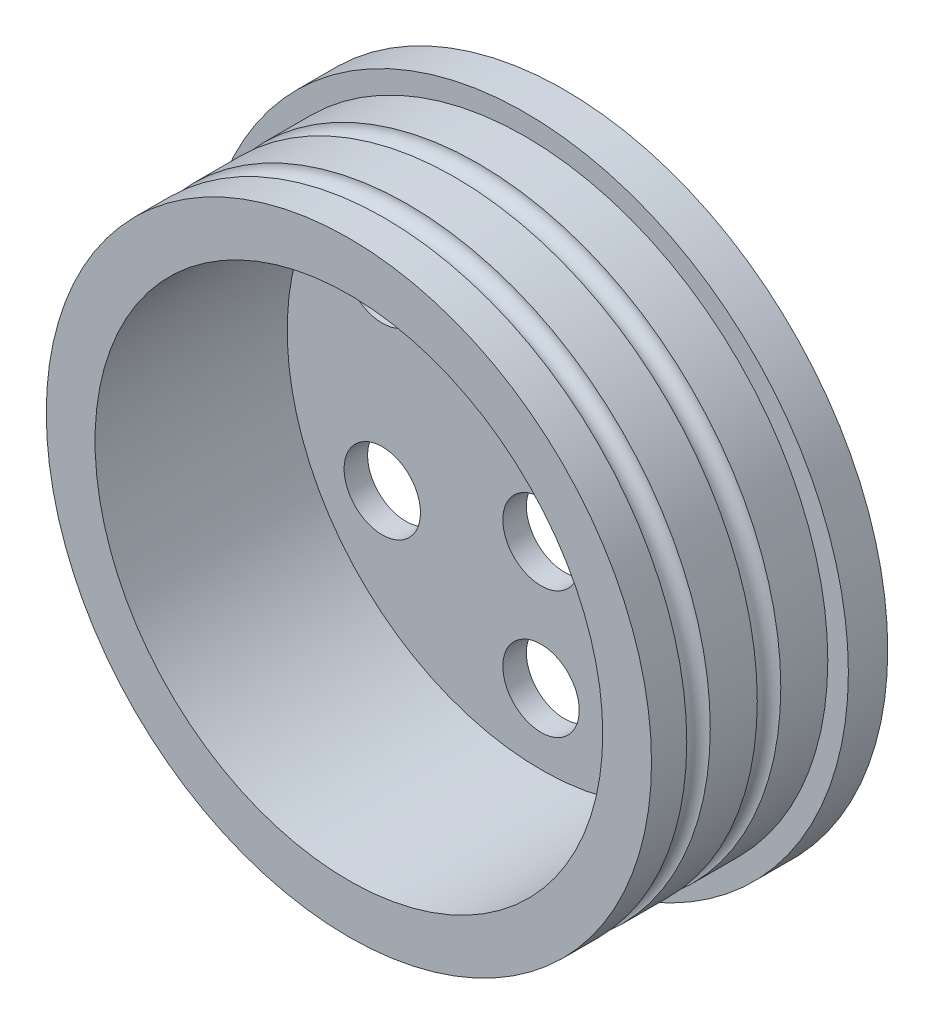
ISO-10303-21;
HEADER;
FILE_DESCRIPTION(('STEP AP214'),'2;1');
FILE_NAME('part.step','',(''),(''),'','','');
FILE_SCHEMA(('AUTOMOTIVE_DESIGN { 1 0 10303 214 1 1 1 1 }'));
ENDSEC;
DATA;
#1=APPLICATION_CONTEXT('core data for automotive mechanical design processes');
#2=APPLICATION_PROTOCOL_DEFINITION('international standard','automotive_design',2000,#1);
#3=PRODUCT_CONTEXT('',#1,'mechanical');
#4=PRODUCT('Part','Part','',(#3));
#5=PRODUCT_RELATED_PRODUCT_CATEGORY('part','',(#4));
#6=PRODUCT_DEFINITION_FORMATION('','',#4);
#7=PRODUCT_DEFINITION_CONTEXT('part definition',#1,'design');
#8=PRODUCT_DEFINITION('design','',#6,#7);
#9=PRODUCT_DEFINITION_SHAPE('','',#8);
#10=(LENGTH_UNIT() NAMED_UNIT(*) SI_UNIT(.MILLI.,.METRE.));
#11=(NAMED_UNIT(*) PLANE_ANGLE_UNIT() SI_UNIT($,.RADIAN.));
#12=(NAMED_UNIT(*) SI_UNIT($,.STERADIAN.) SOLID_ANGLE_UNIT());
#13=UNCERTAINTY_MEASURE_WITH_UNIT(LENGTH_MEASURE(1.E-05),#10,'distance_accuracy_value','');
#14=(GEOMETRIC_REPRESENTATION_CONTEXT(3) GLOBAL_UNCERTAINTY_ASSIGNED_CONTEXT((#13)) GLOBAL_UNIT_ASSIGNED_CONTEXT((#10,
#11,#12)) REPRESENTATION_CONTEXT('',''));
#15=CARTESIAN_POINT('',(0.,0.,0.));
#16=DIRECTION('',(0.,0.,1.));
#17=DIRECTION('',(1.,0.,0.));
#18=AXIS2_PLACEMENT_3D('',#15,#16,#17);
#19=CARTESIAN_POINT('',(0.,0.,36.7));
#20=DIRECTION('',(0.,0.,-1.));
#21=DIRECTION('',(-1.,0.,0.));
#22=AXIS2_PLACEMENT_3D('',#19,#20,#21);
#23=CYLINDRICAL_SURFACE('',#22,51.5);
#24=CARTESIAN_POINT('',(0.,0.,6.7));
#25=DIRECTION('',(0.,0.,1.));
#26=DIRECTION('',(1.,0.,0.));
#27=AXIS2_PLACEMENT_3D('',#24,#25,#26);
#28=CIRCLE('',#27,51.5);
#29=CARTESIAN_POINT('',(51.5,0.,6.7));
#30=VERTEX_POINT('',#29);
#31=EDGE_CURVE('E11',#30,#30,#28,.T.);
#32=ORIENTED_EDGE('',*,*,#31,.T.);
#33=EDGE_LOOP('',(#32));
#34=FACE_BOUND('',#33,.T.);
#35=CARTESIAN_POINT('',(0.,0.,14.7));
#36=DIRECTION('',(0.,0.,1.));
#37=DIRECTION('',(1.,0.,0.));
#38=AXIS2_PLACEMENT_3D('',#35,#36,#37);
#39=CIRCLE('',#38,51.5);
#40=CARTESIAN_POINT('',(51.5,0.,14.7));
#41=VERTEX_POINT('',#40);
#42=EDGE_CURVE('E63',#41,#41,#39,.T.);
#43=ORIENTED_EDGE('',*,*,#42,.F.);
#44=EDGE_LOOP('',(#43));
#45=FACE_BOUND('',#44,.T.);
#46=ADVANCED_FACE('F35',(#34,#45),#23,.T.);
#47=CARTESIAN_POINT('',(0.,0.,6.7));
#48=DIRECTION('',(0.,0.,-1.));
#49=DIRECTION('',(-1.,0.,0.));
#50=AXIS2_PLACEMENT_3D('',#47,#48,#49);
#51=CYLINDRICAL_SURFACE('',#50,55.);
#52=CARTESIAN_POINT('',(0.,0.,6.7));
#53=DIRECTION('',(0.,0.,1.));
#54=DIRECTION('',(1.,0.,0.));
#55=AXIS2_PLACEMENT_3D('',#52,#53,#54);
#56=CIRCLE('',#55,55.);
#57=CARTESIAN_POINT('',(55.,0.,6.7));
#58=VERTEX_POINT('',#57);
#59=EDGE_CURVE('E43',#58,#58,#56,.T.);
#60=ORIENTED_EDGE('',*,*,#59,.F.);
#61=EDGE_LOOP('',(#60));
#62=FACE_BOUND('',#61,.T.);
#63=CARTESIAN_POINT('',(0.,0.,0.));
#64=DIRECTION('',(0.,0.,1.));
#65=DIRECTION('',(1.,0.,0.));
#66=AXIS2_PLACEMENT_3D('',#63,#64,#65);
#67=CIRCLE('',#66,55.);
#68=CARTESIAN_POINT('',(55.,0.,0.));
#69=VERTEX_POINT('',#68);
#70=EDGE_CURVE('E48',#69,#69,#67,.T.);
#71=ORIENTED_EDGE('',*,*,#70,.T.);
#72=EDGE_LOOP('',(#71));
#73=FACE_BOUND('',#72,.T.);
#74=ADVANCED_FACE('F37',(#62,#73),#51,.T.);
#75=CARTESIAN_POINT('',(0.,0.,6.7));
#76=DIRECTION('',(0.,0.,1.));
#77=DIRECTION('',(1.,0.,0.));
#78=AXIS2_PLACEMENT_3D('',#75,#76,#77);
#79=PLANE('',#78);
#80=ORIENTED_EDGE('',*,*,#31,.F.);
#81=EDGE_LOOP('',(#80));
#82=FACE_BOUND('',#81,.T.);
#83=ORIENTED_EDGE('',*,*,#59,.T.);
#84=EDGE_LOOP('',(#83));
#85=FACE_BOUND('',#84,.T.);
#86=ADVANCED_FACE('F147',(#82,#85),#79,.T.);
#87=CARTESIAN_POINT('',(0.,0.,0.));
#88=DIRECTION('',(0.,0.,1.));
#89=DIRECTION('',(1.,0.,0.));
#90=AXIS2_PLACEMENT_3D('',#87,#88,#89);
#91=PLANE('',#90);
#92=CARTESIAN_POINT('',(0.,9.6,0.));
#93=DIRECTION('',(0.,0.,-1.));
#94=DIRECTION('',(-1.,0.,0.));
#95=AXIS2_PLACEMENT_3D('',#92,#93,#94);
#96=CIRCLE('',#95,6.49999999999999);
#97=CARTESIAN_POINT('',(-6.49999999999999,9.6,0.));
#98=VERTEX_POINT('',#97);
#99=EDGE_CURVE('E105',#98,#98,#96,.T.);
#100=ORIENTED_EDGE('',*,*,#99,.F.);
#101=EDGE_LOOP('',(#100));
#102=FACE_BOUND('',#101,.T.);
#103=CARTESIAN_POINT('',(0.,-9.6,0.));
#104=DIRECTION('',(0.,0.,-1.));
#105=DIRECTION('',(-1.,0.,0.));
#106=AXIS2_PLACEMENT_3D('',#103,#104,#105);
#107=CIRCLE('',#106,6.49999999999999);
#108=CARTESIAN_POINT('',(-6.49999999999999,-9.6,0.));
#109=VERTEX_POINT('',#108);
#110=EDGE_CURVE('E95',#109,#109,#107,.T.);
#111=ORIENTED_EDGE('',*,*,#110,.F.);
#112=EDGE_LOOP('',(#111));
#113=FACE_BOUND('',#112,.T.);
#114=CARTESIAN_POINT('',(27.0199925980743,15.6000000000003,0.));
#115=DIRECTION('',(0.,0.,-1.));
#116=DIRECTION('',(-1.,0.,0.));
#117=AXIS2_PLACEMENT_3D('',#114,#115,#116);
#118=CIRCLE('',#117,6.5);
#119=CARTESIAN_POINT('',(20.5199925980743,15.6000000000003,0.));
#120=VERTEX_POINT('',#119);
#121=EDGE_CURVE('E92',#120,#120,#118,.T.);
#122=ORIENTED_EDGE('',*,*,#121,.F.);
#123=EDGE_LOOP('',(#122));
#124=FACE_BOUND('',#123,.T.);
#125=CARTESIAN_POINT('',(27.0199925980746,-15.5999999999997,0.));
#126=DIRECTION('',(0.,0.,-1.));
#127=DIRECTION('',(-1.,0.,0.));
#128=AXIS2_PLACEMENT_3D('',#125,#126,#127);
#129=CIRCLE('',#128,6.5);
#130=CARTESIAN_POINT('',(20.5199925980746,-15.5999999999997,0.));
#131=VERTEX_POINT('',#130);
#132=EDGE_CURVE('E89',#131,#131,#129,.T.);
#133=ORIENTED_EDGE('',*,*,#132,.F.);
#134=EDGE_LOOP('',(#133));
#135=FACE_BOUND('',#134,.T.);
#136=CARTESIAN_POINT('',(0.,-31.2,0.));
#137=DIRECTION('',(0.,0.,-1.));
#138=DIRECTION('',(-1.,0.,0.));
#139=AXIS2_PLACEMENT_3D('',#136,#137,#138);
#140=CIRCLE('',#139,6.5);
#141=CARTESIAN_POINT('',(-6.5,-31.2,0.));
#142=VERTEX_POINT('',#141);
#143=EDGE_CURVE('E85',#142,#142,#140,.T.);
#144=ORIENTED_EDGE('',*,*,#143,.F.);
#145=EDGE_LOOP('',(#144));
#146=FACE_BOUND('',#145,.T.);
#147=CARTESIAN_POINT('',(-27.0199925980744,-15.6000000000001,0.));
#148=DIRECTION('',(0.,0.,-1.));
#149=DIRECTION('',(-1.,0.,0.));
#150=AXIS2_PLACEMENT_3D('',#147,#148,#149);
#151=CIRCLE('',#150,6.5);
#152=CARTESIAN_POINT('',(-33.5199925980744,-15.6000000000001,0.));
#153=VERTEX_POINT('',#152);
#154=EDGE_CURVE('E81',#153,#153,#151,.T.);
#155=ORIENTED_EDGE('',*,*,#154,.F.);
#156=EDGE_LOOP('',(#155));
#157=FACE_BOUND('',#156,.T.);
#158=CARTESIAN_POINT('',(-27.0199925980745,15.5999999999999,0.));
#159=DIRECTION('',(0.,0.,-1.));
#160=DIRECTION('',(-1.,0.,0.));
#161=AXIS2_PLACEMENT_3D('',#158,#159,#160);
#162=CIRCLE('',#161,6.5);
#163=CARTESIAN_POINT('',(-33.5199925980745,15.5999999999999,0.));
#164=VERTEX_POINT('',#163);
#165=EDGE_CURVE('E77',#164,#164,#162,.T.);
#166=ORIENTED_EDGE('',*,*,#165,.F.);
#167=EDGE_LOOP('',(#166));
#168=FACE_BOUND('',#167,.T.);
#169=CARTESIAN_POINT('',(0.,31.2,0.));
#170=DIRECTION('',(0.,0.,-1.));
#171=DIRECTION('',(-1.,0.,0.));
#172=AXIS2_PLACEMENT_3D('',#169,#170,#171);
#173=CIRCLE('',#172,6.5);
#174=CARTESIAN_POINT('',(-6.5,31.2,0.));
#175=VERTEX_POINT('',#174);
#176=EDGE_CURVE('E73',#175,#175,#173,.T.);
#177=ORIENTED_EDGE('',*,*,#176,.F.);
#178=EDGE_LOOP('',(#177));
#179=FACE_BOUND('',#178,.T.);
#180=ORIENTED_EDGE('',*,*,#70,.F.);
#181=EDGE_LOOP('',(#180));
#182=FACE_BOUND('',#181,.T.);
#183=ADVANCED_FACE('F165',(#102,#113,#124,#135,#146,#157,#168,#179,#182),#91,.F.);
#184=CARTESIAN_POINT('',(0.,0.,16.7));
#185=DIRECTION('',(0.,0.,1.));
#186=DIRECTION('',(1.,0.,0.));
#187=AXIS2_PLACEMENT_3D('',#184,#185,#186);
#188=TOROIDAL_SURFACE('',#187,51.5,2.);
#189=ORIENTED_EDGE('',*,*,#42,.T.);
#190=EDGE_LOOP('',(#189));
#191=FACE_BOUND('',#190,.T.);
#192=CARTESIAN_POINT('',(0.,0.,18.7));
#193=DIRECTION('',(0.,0.,-1.));
#194=DIRECTION('',(-1.,0.,0.));
#195=AXIS2_PLACEMENT_3D('',#192,#193,#194);
#196=CIRCLE('',#195,51.5);
#197=CARTESIAN_POINT('',(-51.5,0.,18.7));
#198=VERTEX_POINT('',#197);
#199=EDGE_CURVE('E66',#198,#198,#196,.T.);
#200=ORIENTED_EDGE('',*,*,#199,.T.);
#201=EDGE_LOOP('',(#200));
#202=FACE_BOUND('',#201,.T.);
#203=ADVANCED_FACE('F157',(#191,#202),#188,.F.);
#204=CARTESIAN_POINT('',(0.,0.,26.7));
#205=DIRECTION('',(0.,0.,1.));
#206=DIRECTION('',(1.,0.,0.));
#207=AXIS2_PLACEMENT_3D('',#204,#205,#206);
#208=CIRCLE('',#207,51.5);
#209=CARTESIAN_POINT('',(51.5,0.,26.7));
#210=VERTEX_POINT('',#209);
#211=EDGE_CURVE('E56',#210,#210,#208,.T.);
#212=ORIENTED_EDGE('',*,*,#211,.F.);
#213=EDGE_LOOP('',(#212));
#214=FACE_BOUND('',#213,.T.);
#215=ORIENTED_EDGE('',*,*,#199,.F.);
#216=EDGE_LOOP('',(#215));
#217=FACE_BOUND('',#216,.T.);
#218=ADVANCED_FACE('F143',(#214,#217),#23,.T.);
#219=CARTESIAN_POINT('',(0.,0.,28.7));
#220=DIRECTION('',(0.,0.,1.));
#221=DIRECTION('',(1.,0.,0.));
#222=AXIS2_PLACEMENT_3D('',#219,#220,#221);
#223=TOROIDAL_SURFACE('',#222,51.5,2.);
#224=ORIENTED_EDGE('',*,*,#211,.T.);
#225=EDGE_LOOP('',(#224));
#226=FACE_BOUND('',#225,.T.);
#227=CARTESIAN_POINT('',(0.,0.,30.7));
#228=DIRECTION('',(0.,0.,-1.));
#229=DIRECTION('',(-1.,0.,0.));
#230=AXIS2_PLACEMENT_3D('',#227,#228,#229);
#231=CIRCLE('',#230,51.5);
#232=CARTESIAN_POINT('',(-51.5,0.,30.7));
#233=VERTEX_POINT('',#232);
#234=EDGE_CURVE('E59',#233,#233,#231,.T.);
#235=ORIENTED_EDGE('',*,*,#234,.T.);
#236=EDGE_LOOP('',(#235));
#237=FACE_BOUND('',#236,.T.);
#238=ADVANCED_FACE('F156',(#226,#237),#223,.F.);
#239=CARTESIAN_POINT('',(0.,0.,36.7));
#240=DIRECTION('',(0.,0.,1.));
#241=DIRECTION('',(1.,0.,0.));
#242=AXIS2_PLACEMENT_3D('',#239,#240,#241);
#243=PLANE('',#242);
#244=CARTESIAN_POINT('',(0.,0.,36.7));
#245=DIRECTION('',(0.,0.,1.));
#246=DIRECTION('',(1.,0.,0.));
#247=AXIS2_PLACEMENT_3D('',#244,#245,#246);
#248=CIRCLE('',#247,43.2);
#249=CARTESIAN_POINT('',(43.2,0.,36.7));
#250=VERTEX_POINT('',#249);
#251=EDGE_CURVE('E72',#250,#250,#248,.T.);
#252=ORIENTED_EDGE('',*,*,#251,.F.);
#253=EDGE_LOOP('',(#252));
#254=FACE_BOUND('',#253,.T.);
#255=CARTESIAN_POINT('',(0.,0.,36.7));
#256=DIRECTION('',(0.,0.,1.));
#257=DIRECTION('',(1.,0.,0.));
#258=AXIS2_PLACEMENT_3D('',#255,#256,#257);
#259=CIRCLE('',#258,51.5);
#260=CARTESIAN_POINT('',(51.5,0.,36.7));
#261=VERTEX_POINT('',#260);
#262=EDGE_CURVE('E51',#261,#261,#259,.T.);
#263=ORIENTED_EDGE('',*,*,#262,.T.);
#264=EDGE_LOOP('',(#263));
#265=FACE_BOUND('',#264,.T.);
#266=ADVANCED_FACE('F153',(#254,#265),#243,.T.);
#267=ORIENTED_EDGE('',*,*,#262,.F.);
#268=EDGE_LOOP('',(#267));
#269=FACE_BOUND('',#268,.T.);
#270=ORIENTED_EDGE('',*,*,#234,.F.);
#271=EDGE_LOOP('',(#270));
#272=FACE_BOUND('',#271,.T.);
#273=ADVANCED_FACE('F137',(#269,#272),#23,.T.);
#274=CARTESIAN_POINT('',(0.,0.,-122.188051789035));
#275=DIRECTION('',(0.,0.,1.));
#276=DIRECTION('',(1.,0.,0.));
#277=AXIS2_PLACEMENT_3D('',#274,#275,#276);
#278=CYLINDRICAL_SURFACE('',#277,43.2);
#279=CARTESIAN_POINT('',(0.,0.,3.99999999999999));
#280=DIRECTION('',(0.,0.,1.));
#281=DIRECTION('',(1.,0.,0.));
#282=AXIS2_PLACEMENT_3D('',#279,#280,#281);
#283=CIRCLE('',#282,43.2);
#284=CARTESIAN_POINT('',(43.2,0.,3.99999999999999));
#285=VERTEX_POINT('',#284);
#286=EDGE_CURVE('E60',#285,#285,#283,.F.);
#287=ORIENTED_EDGE('',*,*,#286,.T.);
#288=EDGE_LOOP('',(#287));
#289=FACE_BOUND('',#288,.T.);
#290=ORIENTED_EDGE('',*,*,#251,.T.);
#291=EDGE_LOOP('',(#290));
#292=FACE_BOUND('',#291,.T.);
#293=ADVANCED_FACE('F122',(#289,#292),#278,.F.);
#294=CARTESIAN_POINT('',(0.,0.,4.));
#295=DIRECTION('',(0.,0.,1.));
#296=DIRECTION('',(1.,0.,0.));
#297=AXIS2_PLACEMENT_3D('',#294,#295,#296);
#298=PLANE('',#297);
#299=CARTESIAN_POINT('',(0.,9.6,4.));
#300=DIRECTION('',(0.,0.,1.));
#301=DIRECTION('',(1.,0.,0.));
#302=AXIS2_PLACEMENT_3D('',#299,#300,#301);
#303=CIRCLE('',#302,6.49999999999999);
#304=CARTESIAN_POINT('',(6.49999999999999,9.6,4.));
#305=VERTEX_POINT('',#304);
#306=EDGE_CURVE('E39',#305,#305,#303,.T.);
#307=ORIENTED_EDGE('',*,*,#306,.F.);
#308=EDGE_LOOP('',(#307));
#309=FACE_BOUND('',#308,.T.);
#310=CARTESIAN_POINT('',(0.,-9.6,4.));
#311=DIRECTION('',(0.,0.,1.));
#312=DIRECTION('',(1.,0.,0.));
#313=AXIS2_PLACEMENT_3D('',#310,#311,#312);
#314=CIRCLE('',#313,6.49999999999999);
#315=CARTESIAN_POINT('',(6.49999999999999,-9.6,4.));
#316=VERTEX_POINT('',#315);
#317=EDGE_CURVE('E93',#316,#316,#314,.T.);
#318=ORIENTED_EDGE('',*,*,#317,.F.);
#319=EDGE_LOOP('',(#318));
#320=FACE_BOUND('',#319,.T.);
#321=CARTESIAN_POINT('',(27.0199925980743,15.6000000000003,4.));
#322=DIRECTION('',(0.,0.,1.));
#323=DIRECTION('',(1.,0.,0.));
#324=AXIS2_PLACEMENT_3D('',#321,#322,#323);
#325=CIRCLE('',#324,6.5);
#326=CARTESIAN_POINT('',(33.5199925980743,15.6000000000003,4.));
#327=VERTEX_POINT('',#326);
#328=EDGE_CURVE('E90',#327,#327,#325,.T.);
#329=ORIENTED_EDGE('',*,*,#328,.F.);
#330=EDGE_LOOP('',(#329));
#331=FACE_BOUND('',#330,.T.);
#332=CARTESIAN_POINT('',(27.0199925980746,-15.5999999999997,4.));
#333=DIRECTION('',(0.,0.,1.));
#334=DIRECTION('',(1.,0.,0.));
#335=AXIS2_PLACEMENT_3D('',#332,#333,#334);
#336=CIRCLE('',#335,6.5);
#337=CARTESIAN_POINT('',(33.5199925980746,-15.5999999999997,4.));
#338=VERTEX_POINT('',#337);
#339=EDGE_CURVE('E86',#338,#338,#336,.T.);
#340=ORIENTED_EDGE('',*,*,#339,.F.);
#341=EDGE_LOOP('',(#340));
#342=FACE_BOUND('',#341,.T.);
#343=CARTESIAN_POINT('',(0.,-31.2,4.));
#344=DIRECTION('',(0.,0.,1.));
#345=DIRECTION('',(1.,0.,0.));
#346=AXIS2_PLACEMENT_3D('',#343,#344,#345);
#347=CIRCLE('',#346,6.49999999999999);
#348=CARTESIAN_POINT('',(6.49999999999999,-31.2,4.));
#349=VERTEX_POINT('',#348);
#350=EDGE_CURVE('E82',#349,#349,#347,.T.);
#351=ORIENTED_EDGE('',*,*,#350,.F.);
#352=EDGE_LOOP('',(#351));
#353=FACE_BOUND('',#352,.T.);
#354=CARTESIAN_POINT('',(-27.0199925980744,-15.6000000000001,4.));
#355=DIRECTION('',(0.,0.,1.));
#356=DIRECTION('',(1.,0.,0.));
#357=AXIS2_PLACEMENT_3D('',#354,#355,#356);
#358=CIRCLE('',#357,6.49999999999999);
#359=CARTESIAN_POINT('',(-20.5199925980744,-15.6000000000001,4.));
#360=VERTEX_POINT('',#359);
#361=EDGE_CURVE('E78',#360,#360,#358,.T.);
#362=ORIENTED_EDGE('',*,*,#361,.F.);
#363=EDGE_LOOP('',(#362));
#364=FACE_BOUND('',#363,.T.);
#365=CARTESIAN_POINT('',(-27.0199925980745,15.5999999999999,4.));
#366=DIRECTION('',(0.,0.,1.));
#367=DIRECTION('',(1.,0.,0.));
#368=AXIS2_PLACEMENT_3D('',#365,#366,#367);
#369=CIRCLE('',#368,6.49999999999999);
#370=CARTESIAN_POINT('',(-20.5199925980745,15.5999999999999,4.));
#371=VERTEX_POINT('',#370);
#372=EDGE_CURVE('E74',#371,#371,#369,.T.);
#373=ORIENTED_EDGE('',*,*,#372,.F.);
#374=EDGE_LOOP('',(#373));
#375=FACE_BOUND('',#374,.T.);
#376=CARTESIAN_POINT('',(0.,31.2,4.));
#377=DIRECTION('',(0.,0.,1.));
#378=DIRECTION('',(1.,0.,0.));
#379=AXIS2_PLACEMENT_3D('',#376,#377,#378);
#380=CIRCLE('',#379,6.49999999999999);
#381=CARTESIAN_POINT('',(6.49999999999999,31.2,4.));
#382=VERTEX_POINT('',#381);
#383=EDGE_CURVE('E69',#382,#382,#380,.T.);
#384=ORIENTED_EDGE('',*,*,#383,.F.);
#385=EDGE_LOOP('',(#384));
#386=FACE_BOUND('',#385,.T.);
#387=ORIENTED_EDGE('',*,*,#286,.F.);
#388=EDGE_LOOP('',(#387));
#389=FACE_BOUND('',#388,.T.);
#390=ADVANCED_FACE('F125',(#309,#320,#331,#342,#353,#364,#375,#386,#389),#298,.T.);
#391=CARTESIAN_POINT('',(0.,31.2,0.));
#392=DIRECTION('',(0.,0.,-1.));
#393=DIRECTION('',(-1.,0.,0.));
#394=AXIS2_PLACEMENT_3D('',#391,#392,#393);
#395=CYLINDRICAL_SURFACE('',#394,6.49999999999999);
#396=ORIENTED_EDGE('',*,*,#383,.T.);
#397=EDGE_LOOP('',(#396));
#398=FACE_BOUND('',#397,.T.);
#399=ORIENTED_EDGE('',*,*,#176,.T.);
#400=EDGE_LOOP('',(#399));
#401=FACE_BOUND('',#400,.T.);
#402=ADVANCED_FACE('F127',(#398,#401),#395,.F.);
#403=CARTESIAN_POINT('',(-27.0199925980745,15.5999999999999,0.));
#404=DIRECTION('',(0.,0.,-1.));
#405=DIRECTION('',(-1.,0.,0.));
#406=AXIS2_PLACEMENT_3D('',#403,#404,#405);
#407=CYLINDRICAL_SURFACE('',#406,6.49999999999999);
#408=ORIENTED_EDGE('',*,*,#372,.T.);
#409=EDGE_LOOP('',(#408));
#410=FACE_BOUND('',#409,.T.);
#411=ORIENTED_EDGE('',*,*,#165,.T.);
#412=EDGE_LOOP('',(#411));
#413=FACE_BOUND('',#412,.T.);
#414=ADVANCED_FACE('F134',(#410,#413),#407,.F.);
#415=CARTESIAN_POINT('',(-27.0199925980744,-15.6000000000001,0.));
#416=DIRECTION('',(0.,0.,-1.));
#417=DIRECTION('',(-1.,0.,0.));
#418=AXIS2_PLACEMENT_3D('',#415,#416,#417);
#419=CYLINDRICAL_SURFACE('',#418,6.49999999999999);
#420=ORIENTED_EDGE('',*,*,#361,.T.);
#421=EDGE_LOOP('',(#420));
#422=FACE_BOUND('',#421,.T.);
#423=ORIENTED_EDGE('',*,*,#154,.T.);
#424=EDGE_LOOP('',(#423));
#425=FACE_BOUND('',#424,.T.);
#426=ADVANCED_FACE('F214',(#422,#425),#419,.F.);
#427=CARTESIAN_POINT('',(0.,-31.2,0.));
#428=DIRECTION('',(0.,0.,-1.));
#429=DIRECTION('',(-1.,0.,0.));
#430=AXIS2_PLACEMENT_3D('',#427,#428,#429);
#431=CYLINDRICAL_SURFACE('',#430,6.49999999999999);
#432=ORIENTED_EDGE('',*,*,#350,.T.);
#433=EDGE_LOOP('',(#432));
#434=FACE_BOUND('',#433,.T.);
#435=ORIENTED_EDGE('',*,*,#143,.T.);
#436=EDGE_LOOP('',(#435));
#437=FACE_BOUND('',#436,.T.);
#438=ADVANCED_FACE('F224',(#434,#437),#431,.F.);
#439=CARTESIAN_POINT('',(27.0199925980746,-15.5999999999997,0.));
#440=DIRECTION('',(0.,0.,-1.));
#441=DIRECTION('',(-1.,0.,0.));
#442=AXIS2_PLACEMENT_3D('',#439,#440,#441);
#443=CYLINDRICAL_SURFACE('',#442,6.5);
#444=ORIENTED_EDGE('',*,*,#339,.T.);
#445=EDGE_LOOP('',(#444));
#446=FACE_BOUND('',#445,.T.);
#447=ORIENTED_EDGE('',*,*,#132,.T.);
#448=EDGE_LOOP('',(#447));
#449=FACE_BOUND('',#448,.T.);
#450=ADVANCED_FACE('F234',(#446,#449),#443,.F.);
#451=CARTESIAN_POINT('',(27.0199925980743,15.6000000000003,0.));
#452=DIRECTION('',(0.,0.,-1.));
#453=DIRECTION('',(-1.,0.,0.));
#454=AXIS2_PLACEMENT_3D('',#451,#452,#453);
#455=CYLINDRICAL_SURFACE('',#454,6.5);
#456=ORIENTED_EDGE('',*,*,#328,.T.);
#457=EDGE_LOOP('',(#456));
#458=FACE_BOUND('',#457,.T.);
#459=ORIENTED_EDGE('',*,*,#121,.T.);
#460=EDGE_LOOP('',(#459));
#461=FACE_BOUND('',#460,.T.);
#462=ADVANCED_FACE('F244',(#458,#461),#455,.F.);
#463=CARTESIAN_POINT('',(0.,-9.6,0.));
#464=DIRECTION('',(0.,0.,-1.));
#465=DIRECTION('',(-1.,0.,0.));
#466=AXIS2_PLACEMENT_3D('',#463,#464,#465);
#467=CYLINDRICAL_SURFACE('',#466,6.49999999999999);
#468=ORIENTED_EDGE('',*,*,#317,.T.);
#469=EDGE_LOOP('',(#468));
#470=FACE_BOUND('',#469,.T.);
#471=ORIENTED_EDGE('',*,*,#110,.T.);
#472=EDGE_LOOP('',(#471));
#473=FACE_BOUND('',#472,.T.);
#474=ADVANCED_FACE('F254',(#470,#473),#467,.F.);
#475=CARTESIAN_POINT('',(0.,9.6,0.));
#476=DIRECTION('',(0.,0.,-1.));
#477=DIRECTION('',(-1.,0.,0.));
#478=AXIS2_PLACEMENT_3D('',#475,#476,#477);
#479=CYLINDRICAL_SURFACE('',#478,6.49999999999999);
#480=ORIENTED_EDGE('',*,*,#306,.T.);
#481=EDGE_LOOP('',(#480));
#482=FACE_BOUND('',#481,.T.);
#483=ORIENTED_EDGE('',*,*,#99,.T.);
#484=EDGE_LOOP('',(#483));
#485=FACE_BOUND('',#484,.T.);
#486=ADVANCED_FACE('F264',(#482,#485),#479,.F.);
#487=CLOSED_SHELL('',(#46,#74,#86,#183,#203,#218,#238,#266,#273,#293,#390,#402,#414,#426,#438,
#450,#462,#474,#486));
#488=MANIFOLD_SOLID_BREP('B2',#487);
#489=ADVANCED_BREP_SHAPE_REPRESENTATION('',(#18,#488),#14);
#490=SHAPE_DEFINITION_REPRESENTATION(#9,#489);
ENDSEC;
END-ISO-10303-21;
